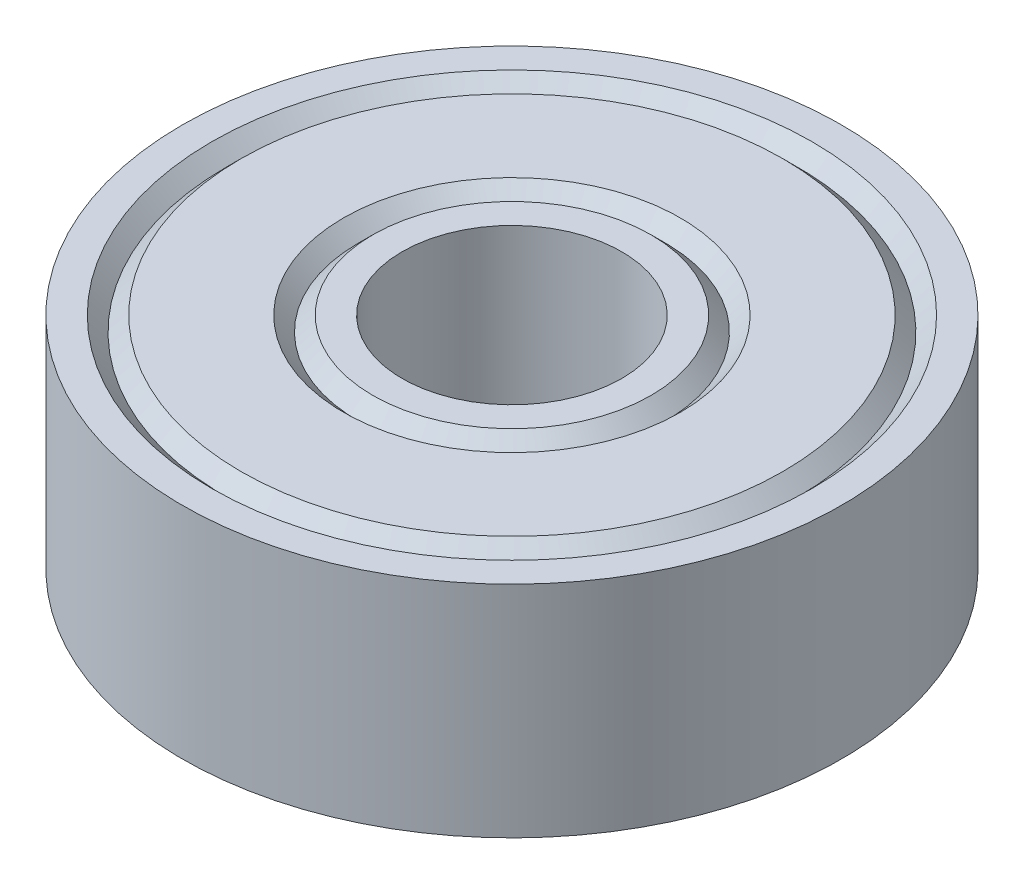
ISO-10303-21;
HEADER;
FILE_DESCRIPTION(('STEP AP214'),'2;1');
FILE_NAME('part.step','',(''),(''),'','','');
FILE_SCHEMA(('AUTOMOTIVE_DESIGN { 1 0 10303 214 1 1 1 1 }'));
ENDSEC;
DATA;
#1=APPLICATION_CONTEXT('core data for automotive mechanical design processes');
#2=APPLICATION_PROTOCOL_DEFINITION('international standard','automotive_design',2000,#1);
#3=PRODUCT_CONTEXT('',#1,'mechanical');
#4=PRODUCT('Part','Part','',(#3));
#5=PRODUCT_RELATED_PRODUCT_CATEGORY('part','',(#4));
#6=PRODUCT_DEFINITION_FORMATION('','',#4);
#7=PRODUCT_DEFINITION_CONTEXT('part definition',#1,'design');
#8=PRODUCT_DEFINITION('design','',#6,#7);
#9=PRODUCT_DEFINITION_SHAPE('','',#8);
#10=(LENGTH_UNIT() NAMED_UNIT(*) SI_UNIT(.MILLI.,.METRE.));
#11=(NAMED_UNIT(*) PLANE_ANGLE_UNIT() SI_UNIT($,.RADIAN.));
#12=(NAMED_UNIT(*) SI_UNIT($,.STERADIAN.) SOLID_ANGLE_UNIT());
#13=UNCERTAINTY_MEASURE_WITH_UNIT(LENGTH_MEASURE(1.E-05),#10,'distance_accuracy_value','');
#14=(GEOMETRIC_REPRESENTATION_CONTEXT(3) GLOBAL_UNCERTAINTY_ASSIGNED_CONTEXT((#13)) GLOBAL_UNIT_ASSIGNED_CONTEXT((#10,
#11,#12)) REPRESENTATION_CONTEXT('',''));
#15=CARTESIAN_POINT('',(0.,0.,0.));
#16=DIRECTION('',(0.,0.,1.));
#17=DIRECTION('',(1.,0.,0.));
#18=AXIS2_PLACEMENT_3D('',#15,#16,#17);
#19=CARTESIAN_POINT('',(0.,2.,0.));
#20=DIRECTION('',(0.,1.,0.));
#21=DIRECTION('',(-1.,0.,0.));
#22=AXIS2_PLACEMENT_3D('',#19,#20,#21);
#23=CYLINDRICAL_SURFACE('',#22,2.);
#24=CARTESIAN_POINT('',(0.,2.,0.));
#25=DIRECTION('',(0.,1.,0.));
#26=DIRECTION('',(-1.,0.,0.));
#27=AXIS2_PLACEMENT_3D('',#24,#25,#26);
#28=CIRCLE('',#27,2.);
#29=CARTESIAN_POINT('',(-2.,2.,0.));
#30=VERTEX_POINT('',#29);
#31=EDGE_CURVE('E83',#30,#30,#28,.T.);
#32=ORIENTED_EDGE('',*,*,#31,.T.);
#33=EDGE_LOOP('',(#32));
#34=FACE_BOUND('',#33,.T.);
#35=CARTESIAN_POINT('',(0.,-2.,0.));
#36=DIRECTION('',(0.,1.,0.));
#37=DIRECTION('',(-1.,0.,0.));
#38=AXIS2_PLACEMENT_3D('',#35,#36,#37);
#39=CIRCLE('',#38,2.);
#40=CARTESIAN_POINT('',(-2.,-2.,0.));
#41=VERTEX_POINT('',#40);
#42=EDGE_CURVE('E10',#41,#41,#39,.T.);
#43=ORIENTED_EDGE('',*,*,#42,.F.);
#44=EDGE_LOOP('',(#43));
#45=FACE_BOUND('',#44,.T.);
#46=ADVANCED_FACE('F31',(#34,#45),#23,.F.);
#47=CARTESIAN_POINT('',(-2.,-2.,0.));
#48=DIRECTION('',(0.,-1.,0.));
#49=DIRECTION('',(1.,0.,0.));
#50=AXIS2_PLACEMENT_3D('',#47,#48,#49);
#51=PLANE('',#50);
#52=ORIENTED_EDGE('',*,*,#42,.T.);
#53=EDGE_LOOP('',(#52));
#54=FACE_BOUND('',#53,.T.);
#55=CARTESIAN_POINT('',(0.,-2.,0.));
#56=DIRECTION('',(0.,1.,0.));
#57=DIRECTION('',(-1.,0.,0.));
#58=AXIS2_PLACEMENT_3D('',#55,#56,#57);
#59=CIRCLE('',#58,2.53333333333333);
#60=CARTESIAN_POINT('',(-2.53333333333333,-2.,0.));
#61=VERTEX_POINT('',#60);
#62=EDGE_CURVE('E37',#61,#61,#59,.T.);
#63=ORIENTED_EDGE('',*,*,#62,.F.);
#64=EDGE_LOOP('',(#63));
#65=FACE_BOUND('',#64,.T.);
#66=ADVANCED_FACE('F101',(#54,#65),#51,.T.);
#67=CARTESIAN_POINT('',(0.,-1.73333333333333,0.));
#68=DIRECTION('',(0.,1.,0.));
#69=DIRECTION('',(-1.,0.,0.));
#70=AXIS2_PLACEMENT_3D('',#67,#68,#69);
#71=CONICAL_SURFACE('',#70,2.8,0.785398163397451);
#72=ORIENTED_EDGE('',*,*,#62,.T.);
#73=EDGE_LOOP('',(#72));
#74=FACE_BOUND('',#73,.T.);
#75=CARTESIAN_POINT('',(0.,-1.73333333333333,0.));
#76=DIRECTION('',(0.,1.,0.));
#77=DIRECTION('',(-1.,0.,0.));
#78=AXIS2_PLACEMENT_3D('',#75,#76,#77);
#79=CIRCLE('',#78,2.8);
#80=CARTESIAN_POINT('',(-2.8,-1.73333333333333,0.));
#81=VERTEX_POINT('',#80);
#82=EDGE_CURVE('E41',#81,#81,#79,.T.);
#83=ORIENTED_EDGE('',*,*,#82,.F.);
#84=EDGE_LOOP('',(#83));
#85=FACE_BOUND('',#84,.T.);
#86=ADVANCED_FACE('F105',(#74,#85),#71,.T.);
#87=CARTESIAN_POINT('',(0.,-2.,0.));
#88=DIRECTION('',(0.,-1.,0.));
#89=DIRECTION('',(1.,0.,0.));
#90=AXIS2_PLACEMENT_3D('',#87,#88,#89);
#91=CONICAL_SURFACE('',#90,3.06666666666667,0.785398163397449);
#92=ORIENTED_EDGE('',*,*,#82,.T.);
#93=EDGE_LOOP('',(#92));
#94=FACE_BOUND('',#93,.T.);
#95=CARTESIAN_POINT('',(0.,-2.,0.));
#96=DIRECTION('',(0.,1.,0.));
#97=DIRECTION('',(-1.,0.,0.));
#98=AXIS2_PLACEMENT_3D('',#95,#96,#97);
#99=CIRCLE('',#98,3.06666666666667);
#100=CARTESIAN_POINT('',(-3.06666666666667,-2.,0.));
#101=VERTEX_POINT('',#100);
#102=EDGE_CURVE('E45',#101,#101,#99,.T.);
#103=ORIENTED_EDGE('',*,*,#102,.F.);
#104=EDGE_LOOP('',(#103));
#105=FACE_BOUND('',#104,.T.);
#106=ADVANCED_FACE('F109',(#94,#105),#91,.F.);
#107=CARTESIAN_POINT('',(-3.06666666666667,-2.,0.));
#108=DIRECTION('',(0.,-1.,0.));
#109=DIRECTION('',(1.,0.,0.));
#110=AXIS2_PLACEMENT_3D('',#107,#108,#109);
#111=PLANE('',#110);
#112=ORIENTED_EDGE('',*,*,#102,.T.);
#113=EDGE_LOOP('',(#112));
#114=FACE_BOUND('',#113,.T.);
#115=CARTESIAN_POINT('',(0.,-2.,0.));
#116=DIRECTION('',(0.,1.,0.));
#117=DIRECTION('',(-1.,0.,0.));
#118=AXIS2_PLACEMENT_3D('',#115,#116,#117);
#119=CIRCLE('',#118,4.93333333333333);
#120=CARTESIAN_POINT('',(-4.93333333333333,-2.,0.));
#121=VERTEX_POINT('',#120);
#122=EDGE_CURVE('E50',#121,#121,#119,.T.);
#123=ORIENTED_EDGE('',*,*,#122,.F.);
#124=EDGE_LOOP('',(#123));
#125=FACE_BOUND('',#124,.T.);
#126=ADVANCED_FACE('F115',(#114,#125),#111,.T.);
#127=CARTESIAN_POINT('',(0.,-1.73333333333333,0.));
#128=DIRECTION('',(0.,1.,0.));
#129=DIRECTION('',(-1.,0.,0.));
#130=AXIS2_PLACEMENT_3D('',#127,#128,#129);
#131=CONICAL_SURFACE('',#130,5.2,0.78539816339745);
#132=ORIENTED_EDGE('',*,*,#122,.T.);
#133=EDGE_LOOP('',(#132));
#134=FACE_BOUND('',#133,.T.);
#135=CARTESIAN_POINT('',(0.,-1.73333333333333,0.));
#136=DIRECTION('',(0.,1.,0.));
#137=DIRECTION('',(-1.,0.,0.));
#138=AXIS2_PLACEMENT_3D('',#135,#136,#137);
#139=CIRCLE('',#138,5.2);
#140=CARTESIAN_POINT('',(-5.2,-1.73333333333333,0.));
#141=VERTEX_POINT('',#140);
#142=EDGE_CURVE('E53',#141,#141,#139,.T.);
#143=ORIENTED_EDGE('',*,*,#142,.F.);
#144=EDGE_LOOP('',(#143));
#145=FACE_BOUND('',#144,.T.);
#146=ADVANCED_FACE('F119',(#134,#145),#131,.T.);
#147=CARTESIAN_POINT('',(0.,-2.,0.));
#148=DIRECTION('',(0.,-1.,0.));
#149=DIRECTION('',(1.,0.,0.));
#150=AXIS2_PLACEMENT_3D('',#147,#148,#149);
#151=CONICAL_SURFACE('',#150,5.46666666666667,0.785398163397445);
#152=ORIENTED_EDGE('',*,*,#142,.T.);
#153=EDGE_LOOP('',(#152));
#154=FACE_BOUND('',#153,.T.);
#155=CARTESIAN_POINT('',(0.,-2.,0.));
#156=DIRECTION('',(0.,1.,0.));
#157=DIRECTION('',(-1.,0.,0.));
#158=AXIS2_PLACEMENT_3D('',#155,#156,#157);
#159=CIRCLE('',#158,5.46666666666667);
#160=CARTESIAN_POINT('',(-5.46666666666667,-2.,0.));
#161=VERTEX_POINT('',#160);
#162=EDGE_CURVE('E56',#161,#161,#159,.T.);
#163=ORIENTED_EDGE('',*,*,#162,.F.);
#164=EDGE_LOOP('',(#163));
#165=FACE_BOUND('',#164,.T.);
#166=ADVANCED_FACE('F123',(#154,#165),#151,.F.);
#167=CARTESIAN_POINT('',(-5.46666666666667,-2.,0.));
#168=DIRECTION('',(0.,-1.,0.));
#169=DIRECTION('',(1.,0.,0.));
#170=AXIS2_PLACEMENT_3D('',#167,#168,#169);
#171=PLANE('',#170);
#172=ORIENTED_EDGE('',*,*,#162,.T.);
#173=EDGE_LOOP('',(#172));
#174=FACE_BOUND('',#173,.T.);
#175=CARTESIAN_POINT('',(0.,-2.,0.));
#176=DIRECTION('',(0.,1.,0.));
#177=DIRECTION('',(-1.,0.,0.));
#178=AXIS2_PLACEMENT_3D('',#175,#176,#177);
#179=CIRCLE('',#178,6.);
#180=CARTESIAN_POINT('',(-6.,-2.,0.));
#181=VERTEX_POINT('',#180);
#182=EDGE_CURVE('E59',#181,#181,#179,.T.);
#183=ORIENTED_EDGE('',*,*,#182,.F.);
#184=EDGE_LOOP('',(#183));
#185=FACE_BOUND('',#184,.T.);
#186=ADVANCED_FACE('F127',(#174,#185),#171,.T.);
#187=CARTESIAN_POINT('',(0.,2.,0.));
#188=DIRECTION('',(0.,1.,0.));
#189=DIRECTION('',(-1.,0.,0.));
#190=AXIS2_PLACEMENT_3D('',#187,#188,#189);
#191=CYLINDRICAL_SURFACE('',#190,6.);
#192=ORIENTED_EDGE('',*,*,#182,.T.);
#193=EDGE_LOOP('',(#192));
#194=FACE_BOUND('',#193,.T.);
#195=CARTESIAN_POINT('',(0.,2.,0.));
#196=DIRECTION('',(0.,1.,0.));
#197=DIRECTION('',(-1.,0.,0.));
#198=AXIS2_PLACEMENT_3D('',#195,#196,#197);
#199=CIRCLE('',#198,6.);
#200=CARTESIAN_POINT('',(-6.,2.,0.));
#201=VERTEX_POINT('',#200);
#202=EDGE_CURVE('E62',#201,#201,#199,.T.);
#203=ORIENTED_EDGE('',*,*,#202,.F.);
#204=EDGE_LOOP('',(#203));
#205=FACE_BOUND('',#204,.T.);
#206=ADVANCED_FACE('F131',(#194,#205),#191,.T.);
#207=CARTESIAN_POINT('',(-5.46666666666667,2.,0.));
#208=DIRECTION('',(0.,1.,0.));
#209=DIRECTION('',(-1.,0.,0.));
#210=AXIS2_PLACEMENT_3D('',#207,#208,#209);
#211=PLANE('',#210);
#212=ORIENTED_EDGE('',*,*,#202,.T.);
#213=EDGE_LOOP('',(#212));
#214=FACE_BOUND('',#213,.T.);
#215=CARTESIAN_POINT('',(0.,2.,0.));
#216=DIRECTION('',(0.,1.,0.));
#217=DIRECTION('',(-1.,0.,0.));
#218=AXIS2_PLACEMENT_3D('',#215,#216,#217);
#219=CIRCLE('',#218,5.46666666666667);
#220=CARTESIAN_POINT('',(-5.46666666666667,2.,0.));
#221=VERTEX_POINT('',#220);
#222=EDGE_CURVE('E65',#221,#221,#219,.T.);
#223=ORIENTED_EDGE('',*,*,#222,.F.);
#224=EDGE_LOOP('',(#223));
#225=FACE_BOUND('',#224,.T.);
#226=ADVANCED_FACE('F135',(#214,#225),#211,.T.);
#227=CARTESIAN_POINT('',(0.,1.73333333333333,0.));
#228=DIRECTION('',(0.,1.,0.));
#229=DIRECTION('',(-1.,0.,0.));
#230=AXIS2_PLACEMENT_3D('',#227,#228,#229);
#231=CONICAL_SURFACE('',#230,5.2,0.785398163397446);
#232=ORIENTED_EDGE('',*,*,#222,.T.);
#233=EDGE_LOOP('',(#232));
#234=FACE_BOUND('',#233,.T.);
#235=CARTESIAN_POINT('',(0.,1.73333333333333,0.));
#236=DIRECTION('',(0.,1.,0.));
#237=DIRECTION('',(-1.,0.,0.));
#238=AXIS2_PLACEMENT_3D('',#235,#236,#237);
#239=CIRCLE('',#238,5.2);
#240=CARTESIAN_POINT('',(-5.2,1.73333333333333,0.));
#241=VERTEX_POINT('',#240);
#242=EDGE_CURVE('E68',#241,#241,#239,.T.);
#243=ORIENTED_EDGE('',*,*,#242,.F.);
#244=EDGE_LOOP('',(#243));
#245=FACE_BOUND('',#244,.T.);
#246=ADVANCED_FACE('F139',(#234,#245),#231,.F.);
#247=CARTESIAN_POINT('',(0.,2.,0.));
#248=DIRECTION('',(0.,-1.,0.));
#249=DIRECTION('',(1.,0.,0.));
#250=AXIS2_PLACEMENT_3D('',#247,#248,#249);
#251=CONICAL_SURFACE('',#250,4.93333333333333,0.78539816339745);
#252=ORIENTED_EDGE('',*,*,#242,.T.);
#253=EDGE_LOOP('',(#252));
#254=FACE_BOUND('',#253,.T.);
#255=CARTESIAN_POINT('',(0.,2.,0.));
#256=DIRECTION('',(0.,1.,0.));
#257=DIRECTION('',(-1.,0.,0.));
#258=AXIS2_PLACEMENT_3D('',#255,#256,#257);
#259=CIRCLE('',#258,4.93333333333333);
#260=CARTESIAN_POINT('',(-4.93333333333333,2.,0.));
#261=VERTEX_POINT('',#260);
#262=EDGE_CURVE('E71',#261,#261,#259,.T.);
#263=ORIENTED_EDGE('',*,*,#262,.F.);
#264=EDGE_LOOP('',(#263));
#265=FACE_BOUND('',#264,.T.);
#266=ADVANCED_FACE('F143',(#254,#265),#251,.T.);
#267=CARTESIAN_POINT('',(-3.06666666666667,2.,0.));
#268=DIRECTION('',(0.,1.,0.));
#269=DIRECTION('',(-1.,0.,0.));
#270=AXIS2_PLACEMENT_3D('',#267,#268,#269);
#271=PLANE('',#270);
#272=ORIENTED_EDGE('',*,*,#262,.T.);
#273=EDGE_LOOP('',(#272));
#274=FACE_BOUND('',#273,.T.);
#275=CARTESIAN_POINT('',(0.,2.,0.));
#276=DIRECTION('',(0.,1.,0.));
#277=DIRECTION('',(-1.,0.,0.));
#278=AXIS2_PLACEMENT_3D('',#275,#276,#277);
#279=CIRCLE('',#278,3.06666666666667);
#280=CARTESIAN_POINT('',(-3.06666666666667,2.,0.));
#281=VERTEX_POINT('',#280);
#282=EDGE_CURVE('E74',#281,#281,#279,.T.);
#283=ORIENTED_EDGE('',*,*,#282,.F.);
#284=EDGE_LOOP('',(#283));
#285=FACE_BOUND('',#284,.T.);
#286=ADVANCED_FACE('F147',(#274,#285),#271,.T.);
#287=CARTESIAN_POINT('',(0.,1.73333333333333,0.));
#288=DIRECTION('',(0.,1.,0.));
#289=DIRECTION('',(-1.,0.,0.));
#290=AXIS2_PLACEMENT_3D('',#287,#288,#289);
#291=CONICAL_SURFACE('',#290,2.8,0.785398163397448);
#292=ORIENTED_EDGE('',*,*,#282,.T.);
#293=EDGE_LOOP('',(#292));
#294=FACE_BOUND('',#293,.T.);
#295=CARTESIAN_POINT('',(0.,1.73333333333333,0.));
#296=DIRECTION('',(0.,1.,0.));
#297=DIRECTION('',(-1.,0.,0.));
#298=AXIS2_PLACEMENT_3D('',#295,#296,#297);
#299=CIRCLE('',#298,2.8);
#300=CARTESIAN_POINT('',(-2.8,1.73333333333333,0.));
#301=VERTEX_POINT('',#300);
#302=EDGE_CURVE('E77',#301,#301,#299,.T.);
#303=ORIENTED_EDGE('',*,*,#302,.F.);
#304=EDGE_LOOP('',(#303));
#305=FACE_BOUND('',#304,.T.);
#306=ADVANCED_FACE('F97',(#294,#305),#291,.F.);
#307=CARTESIAN_POINT('',(0.,2.,0.));
#308=DIRECTION('',(0.,-1.,0.));
#309=DIRECTION('',(1.,0.,0.));
#310=AXIS2_PLACEMENT_3D('',#307,#308,#309);
#311=CONICAL_SURFACE('',#310,2.53333333333333,0.785398163397448);
#312=ORIENTED_EDGE('',*,*,#302,.T.);
#313=EDGE_LOOP('',(#312));
#314=FACE_BOUND('',#313,.T.);
#315=CARTESIAN_POINT('',(0.,2.,0.));
#316=DIRECTION('',(0.,1.,0.));
#317=DIRECTION('',(-1.,0.,0.));
#318=AXIS2_PLACEMENT_3D('',#315,#316,#317);
#319=CIRCLE('',#318,2.53333333333333);
#320=CARTESIAN_POINT('',(-2.53333333333333,2.,0.));
#321=VERTEX_POINT('',#320);
#322=EDGE_CURVE('E80',#321,#321,#319,.T.);
#323=ORIENTED_EDGE('',*,*,#322,.F.);
#324=EDGE_LOOP('',(#323));
#325=FACE_BOUND('',#324,.T.);
#326=ADVANCED_FACE('F91',(#314,#325),#311,.T.);
#327=CARTESIAN_POINT('',(-2.,2.,0.));
#328=DIRECTION('',(0.,1.,0.));
#329=DIRECTION('',(-1.,0.,0.));
#330=AXIS2_PLACEMENT_3D('',#327,#328,#329);
#331=PLANE('',#330);
#332=ORIENTED_EDGE('',*,*,#322,.T.);
#333=EDGE_LOOP('',(#332));
#334=FACE_BOUND('',#333,.T.);
#335=ORIENTED_EDGE('',*,*,#31,.F.);
#336=EDGE_LOOP('',(#335));
#337=FACE_BOUND('',#336,.T.);
#338=ADVANCED_FACE('F89',(#334,#337),#331,.T.);
#339=CLOSED_SHELL('',(#46,#66,#86,#106,#126,#146,#166,#186,#206,#226,#246,#266,#286,#306,#326,#338));
#340=MANIFOLD_SOLID_BREP('B2',#339);
#341=ADVANCED_BREP_SHAPE_REPRESENTATION('',(#18,#340),#14);
#342=SHAPE_DEFINITION_REPRESENTATION(#9,#341);
ENDSEC;
END-ISO-10303-21;
